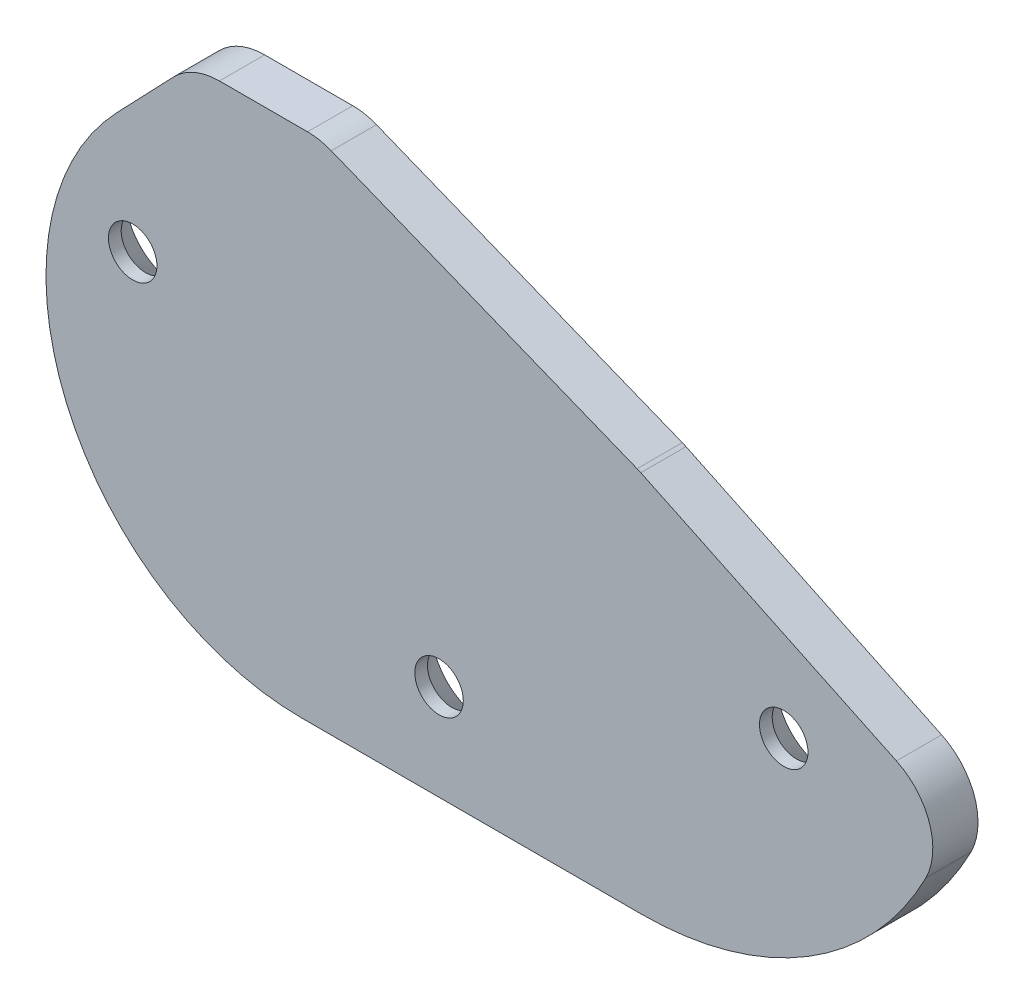
ISO-10303-21;
HEADER;
FILE_DESCRIPTION(('STEP AP214'),'2;1');
FILE_NAME('part.step','',(''),(''),'','','');
FILE_SCHEMA(('AUTOMOTIVE_DESIGN { 1 0 10303 214 1 1 1 1 }'));
ENDSEC;
DATA;
#1=APPLICATION_CONTEXT('core data for automotive mechanical design processes');
#2=APPLICATION_PROTOCOL_DEFINITION('international standard','automotive_design',2000,#1);
#3=PRODUCT_CONTEXT('',#1,'mechanical');
#4=PRODUCT('Part','Part','',(#3));
#5=PRODUCT_RELATED_PRODUCT_CATEGORY('part','',(#4));
#6=PRODUCT_DEFINITION_FORMATION('','',#4);
#7=PRODUCT_DEFINITION_CONTEXT('part definition',#1,'design');
#8=PRODUCT_DEFINITION('design','',#6,#7);
#9=PRODUCT_DEFINITION_SHAPE('','',#8);
#10=(LENGTH_UNIT() NAMED_UNIT(*) SI_UNIT(.MILLI.,.METRE.));
#11=(NAMED_UNIT(*) PLANE_ANGLE_UNIT() SI_UNIT($,.RADIAN.));
#12=(NAMED_UNIT(*) SI_UNIT($,.STERADIAN.) SOLID_ANGLE_UNIT());
#13=UNCERTAINTY_MEASURE_WITH_UNIT(LENGTH_MEASURE(1.E-05),#10,'distance_accuracy_value','');
#14=(GEOMETRIC_REPRESENTATION_CONTEXT(3) GLOBAL_UNCERTAINTY_ASSIGNED_CONTEXT((#13)) GLOBAL_UNIT_ASSIGNED_CONTEXT((#10,
#11,#12)) REPRESENTATION_CONTEXT('',''));
#15=CARTESIAN_POINT('',(0.,0.,0.));
#16=DIRECTION('',(0.,0.,1.));
#17=DIRECTION('',(1.,0.,0.));
#18=AXIS2_PLACEMENT_3D('',#15,#16,#17);
#19=CARTESIAN_POINT('',(101.6,0.,4.4958));
#20=DIRECTION('',(0.,1.,0.));
#21=DIRECTION('',(-1.,0.,0.));
#22=AXIS2_PLACEMENT_3D('',#19,#20,#21);
#23=PLANE('',#22);
#24=DIRECTION('',(0.,0.,1.));
#25=VECTOR('',#24,1.);
#26=CARTESIAN_POINT('',(70.9764049138577,0.,0.));
#27=LINE('',#26,#25);
#28=CARTESIAN_POINT('',(70.9764049138577,0.,0.));
#29=VERTEX_POINT('',#28);
#30=CARTESIAN_POINT('',(70.9764049138577,0.,4.4958));
#31=VERTEX_POINT('',#30);
#32=EDGE_CURVE('E130',#29,#31,#27,.T.);
#33=ORIENTED_EDGE('',*,*,#32,.T.);
#34=DIRECTION('',(1.,0.,0.));
#35=VECTOR('',#34,1.);
#36=CARTESIAN_POINT('',(101.6,0.,4.4958));
#37=LINE('',#36,#35);
#38=CARTESIAN_POINT('',(37.0944442407192,0.,4.4958));
#39=VERTEX_POINT('',#38);
#40=EDGE_CURVE('E162',#39,#31,#37,.T.);
#41=ORIENTED_EDGE('',*,*,#40,.F.);
#42=DIRECTION('',(0.,0.,1.));
#43=VECTOR('',#42,1.);
#44=CARTESIAN_POINT('',(37.0944442407192,0.,0.));
#45=LINE('',#44,#43);
#46=CARTESIAN_POINT('',(37.0944442407192,0.,0.));
#47=VERTEX_POINT('',#46);
#48=EDGE_CURVE('E142',#47,#39,#45,.T.);
#49=ORIENTED_EDGE('',*,*,#48,.F.);
#50=DIRECTION('',(1.,0.,0.));
#51=VECTOR('',#50,1.);
#52=CARTESIAN_POINT('',(101.6,0.,0.));
#53=LINE('',#52,#51);
#54=EDGE_CURVE('E125',#47,#29,#53,.T.);
#55=ORIENTED_EDGE('',*,*,#54,.T.);
#56=EDGE_LOOP('',(#33,#41,#49,#55));
#57=FACE_BOUND('',#56,.T.);
#58=ADVANCED_FACE('F33',(#57),#23,.F.);
#59=CARTESIAN_POINT('',(26.2420825003529,50.8,4.4958));
#60=DIRECTION('',(0.722605301638805,-0.69126086106729,0.));
#61=DIRECTION('',(0.69126086106729,0.722605301638805,0.));
#62=AXIS2_PLACEMENT_3D('',#59,#60,#61);
#63=PLANE('',#62);
#64=DIRECTION('',(-0.69126086106729,-0.722605301638805,0.));
#65=VECTOR('',#64,1.);
#66=CARTESIAN_POINT('',(26.2420825003529,50.8,4.4958));
#67=LINE('',#66,#65);
#68=CARTESIAN_POINT('',(24.366629270038,48.8395064677773,4.4958));
#69=VERTEX_POINT('',#68);
#70=CARTESIAN_POINT('',(18.7402695790936,42.9580258711092,4.4958));
#71=VERTEX_POINT('',#70);
#72=EDGE_CURVE('E153',#69,#71,#67,.T.);
#73=ORIENTED_EDGE('',*,*,#72,.F.);
#74=DIRECTION('',(0.,0.,-1.));
#75=VECTOR('',#74,1.);
#76=CARTESIAN_POINT('',(24.366629270038,48.8395064677773,4.4958));
#77=LINE('',#76,#75);
#78=CARTESIAN_POINT('',(24.366629270038,48.8395064677773,0.));
#79=VERTEX_POINT('',#78);
#80=EDGE_CURVE('E163',#69,#79,#77,.T.);
#81=ORIENTED_EDGE('',*,*,#80,.T.);
#82=DIRECTION('',(-0.69126086106729,-0.722605301638805,0.));
#83=VECTOR('',#82,1.);
#84=CARTESIAN_POINT('',(26.2420825003529,50.8,0.));
#85=LINE('',#84,#83);
#86=CARTESIAN_POINT('',(18.7402695790935,42.9580258711092,0.));
#87=VERTEX_POINT('',#86);
#88=EDGE_CURVE('E160',#79,#87,#85,.T.);
#89=ORIENTED_EDGE('',*,*,#88,.T.);
#90=DIRECTION('',(0.,0.,1.));
#91=VECTOR('',#90,1.);
#92=CARTESIAN_POINT('',(18.7402695790935,42.9580258711092,0.));
#93=LINE('',#92,#91);
#94=EDGE_CURVE('E214',#87,#71,#93,.T.);
#95=ORIENTED_EDGE('',*,*,#94,.T.);
#96=EDGE_LOOP('',(#73,#81,#89,#95));
#97=FACE_BOUND('',#96,.T.);
#98=ADVANCED_FACE('F242',(#97),#63,.F.);
#99=CARTESIAN_POINT('',(0.,0.,4.4958));
#100=DIRECTION('',(0.,0.,-1.));
#101=DIRECTION('',(-1.,0.,0.));
#102=AXIS2_PLACEMENT_3D('',#99,#100,#101);
#103=PLANE('',#102);
#104=DIRECTION('',(-1.,0.,0.));
#105=VECTOR('',#104,1.);
#106=CARTESIAN_POINT('',(26.2420825003529,50.8,4.4958));
#107=LINE('',#106,#105);
#108=CARTESIAN_POINT('',(37.7183314091178,50.8,4.4958));
#109=VERTEX_POINT('',#108);
#110=CARTESIAN_POINT('',(28.9551729354444,50.8,4.4958));
#111=VERTEX_POINT('',#110);
#112=EDGE_CURVE('E229',#109,#111,#107,.T.);
#113=ORIENTED_EDGE('',*,*,#112,.T.);
#114=CARTESIAN_POINT('',(28.9551729354445,44.45,4.4958));
#115=DIRECTION('',(0.,0.,-1.));
#116=DIRECTION('',(-1.,0.,0.));
#117=AXIS2_PLACEMENT_3D('',#114,#115,#116);
#118=CIRCLE('',#117,6.35);
#119=EDGE_CURVE('E183',#111,#69,#118,.F.);
#120=ORIENTED_EDGE('',*,*,#119,.T.);
#121=ORIENTED_EDGE('',*,*,#72,.T.);
#122=CARTESIAN_POINT('',(37.0944442407192,25.4,4.4958));
#123=DIRECTION('',(0.,0.,-1.));
#124=DIRECTION('',(1.,0.,0.));
#125=AXIS2_PLACEMENT_3D('',#122,#123,#124);
#126=CIRCLE('',#125,25.4);
#127=EDGE_CURVE('E139',#39,#71,#126,.T.);
#128=ORIENTED_EDGE('',*,*,#127,.F.);
#129=ORIENTED_EDGE('',*,*,#40,.T.);
#130=CARTESIAN_POINT('',(70.9764049138577,31.75,4.4958));
#131=DIRECTION('',(0.,0.,-1.));
#132=DIRECTION('',(-1.,0.,0.));
#133=AXIS2_PLACEMENT_3D('',#130,#131,#132);
#134=CIRCLE('',#133,31.75);
#135=CARTESIAN_POINT('',(99.2261027725313,17.2580342639913,4.4958));
#136=VERTEX_POINT('',#135);
#137=EDGE_CURVE('E131',#136,#31,#134,.T.);
#138=ORIENTED_EDGE('',*,*,#137,.F.);
#139=CARTESIAN_POINT('',(93.5761632007966,20.1564274111931,4.4958));
#140=DIRECTION('',(0.,0.,-1.));
#141=DIRECTION('',(-1.,0.,0.));
#142=AXIS2_PLACEMENT_3D('',#139,#140,#141);
#143=CIRCLE('',#142,6.35);
#144=CARTESIAN_POINT('',(96.3069073282395,25.8892745668772,4.4958));
#145=VERTEX_POINT('',#144);
#146=EDGE_CURVE('E178',#136,#145,#143,.F.);
#147=ORIENTED_EDGE('',*,*,#146,.T.);
#148=DIRECTION('',(-0.902810575698297,0.430038445266595,0.));
#149=VECTOR('',#148,1.);
#150=CARTESIAN_POINT('',(70.6920825003529,38.0904602211774,4.4958));
#151=LINE('',#150,#149);
#152=CARTESIAN_POINT('',(70.8749362686987,38.0033609421401,4.4958));
#153=VERTEX_POINT('',#152);
#154=EDGE_CURVE('E226',#145,#153,#151,.T.);
#155=ORIENTED_EDGE('',*,*,#154,.T.);
#156=CARTESIAN_POINT('',(68.1441921412558,32.2705137864559,4.4958));
#157=DIRECTION('',(0.,0.,-1.));
#158=DIRECTION('',(-1.,0.,0.));
#159=AXIS2_PLACEMENT_3D('',#156,#157,#158);
#160=CIRCLE('',#159,6.35);
#161=CARTESIAN_POINT('',(70.5040498474147,38.165729779673,4.4958));
#162=VERTEX_POINT('',#161);
#163=EDGE_CURVE('E57',#153,#162,#160,.F.);
#164=ORIENTED_EDGE('',*,*,#163,.T.);
#165=DIRECTION('',(-0.928380471372771,0.371631134828167,0.));
#166=VECTOR('',#165,1.);
#167=CARTESIAN_POINT('',(38.9420825003529,50.8,4.4958));
#168=LINE('',#167,#166);
#169=CARTESIAN_POINT('',(40.0781891152767,50.3452159932171,4.4958));
#170=VERTEX_POINT('',#169);
#171=EDGE_CURVE('E228',#162,#170,#168,.T.);
#172=ORIENTED_EDGE('',*,*,#171,.T.);
#173=CARTESIAN_POINT('',(37.7183314091178,44.45,4.4958));
#174=DIRECTION('',(0.,0.,-1.));
#175=DIRECTION('',(-1.,0.,0.));
#176=AXIS2_PLACEMENT_3D('',#173,#174,#175);
#177=CIRCLE('',#176,6.35);
#178=EDGE_CURVE('E181',#170,#109,#177,.F.);
#179=ORIENTED_EDGE('',*,*,#178,.T.);
#180=EDGE_LOOP('',(#113,#120,#121,#128,#129,#138,#147,#155,#164,#172,#179));
#181=FACE_BOUND('',#180,.T.);
#182=CARTESIAN_POINT('',(20.32,31.75,4.4958));
#183=DIRECTION('',(0.,0.,1.));
#184=DIRECTION('',(1.,0.,0.));
#185=AXIS2_PLACEMENT_3D('',#182,#183,#184);
#186=CIRCLE('',#185,2.413);
#187=CARTESIAN_POINT('',(22.733,31.75,4.4958));
#188=VERTEX_POINT('',#187);
#189=EDGE_CURVE('E144',#188,#188,#186,.T.);
#190=ORIENTED_EDGE('',*,*,#189,.F.);
#191=EDGE_LOOP('',(#190));
#192=FACE_BOUND('',#191,.T.);
#193=CARTESIAN_POINT('',(50.8,9.52499999999999,4.4958));
#194=DIRECTION('',(0.,0.,1.));
#195=DIRECTION('',(1.,0.,0.));
#196=AXIS2_PLACEMENT_3D('',#193,#194,#195);
#197=CIRCLE('',#196,2.41299999999999);
#198=CARTESIAN_POINT('',(53.213,9.52499999999999,4.4958));
#199=VERTEX_POINT('',#198);
#200=EDGE_CURVE('E150',#199,#199,#197,.T.);
#201=ORIENTED_EDGE('',*,*,#200,.F.);
#202=EDGE_LOOP('',(#201));
#203=FACE_BOUND('',#202,.T.);
#204=CARTESIAN_POINT('',(85.09,22.225,4.4958));
#205=DIRECTION('',(0.,0.,1.));
#206=DIRECTION('',(1.,0.,0.));
#207=AXIS2_PLACEMENT_3D('',#204,#205,#206);
#208=CIRCLE('',#207,2.413);
#209=CARTESIAN_POINT('',(87.503,22.225,4.4958));
#210=VERTEX_POINT('',#209);
#211=EDGE_CURVE('E218',#210,#210,#208,.T.);
#212=ORIENTED_EDGE('',*,*,#211,.F.);
#213=EDGE_LOOP('',(#212));
#214=FACE_BOUND('',#213,.T.);
#215=ADVANCED_FACE('F235',(#181,#192,#203,#214),#103,.F.);
#216=CARTESIAN_POINT('',(0.,0.,0.));
#217=DIRECTION('',(0.,0.,-1.));
#218=DIRECTION('',(-1.,0.,0.));
#219=AXIS2_PLACEMENT_3D('',#216,#217,#218);
#220=PLANE('',#219);
#221=CARTESIAN_POINT('',(85.09,22.225,0.));
#222=DIRECTION('',(0.,0.,-1.));
#223=DIRECTION('',(-1.,0.,0.));
#224=AXIS2_PLACEMENT_3D('',#221,#222,#223);
#225=CIRCLE('',#224,5.21969999999999);
#226=CARTESIAN_POINT('',(79.8703,22.225,0.));
#227=VERTEX_POINT('',#226);
#228=EDGE_CURVE('E208',#227,#227,#225,.T.);
#229=ORIENTED_EDGE('',*,*,#228,.F.);
#230=EDGE_LOOP('',(#229));
#231=FACE_BOUND('',#230,.T.);
#232=CARTESIAN_POINT('',(50.8,9.52499999999999,0.));
#233=DIRECTION('',(0.,0.,-1.));
#234=DIRECTION('',(-1.,0.,0.));
#235=AXIS2_PLACEMENT_3D('',#232,#233,#234);
#236=CIRCLE('',#235,5.2197);
#237=CARTESIAN_POINT('',(45.5803,9.52499999999999,0.));
#238=VERTEX_POINT('',#237);
#239=EDGE_CURVE('E198',#238,#238,#236,.T.);
#240=ORIENTED_EDGE('',*,*,#239,.F.);
#241=EDGE_LOOP('',(#240));
#242=FACE_BOUND('',#241,.T.);
#243=CARTESIAN_POINT('',(20.32,31.75,0.));
#244=DIRECTION('',(0.,0.,-1.));
#245=DIRECTION('',(-1.,0.,0.));
#246=AXIS2_PLACEMENT_3D('',#243,#244,#245);
#247=CIRCLE('',#246,5.2197);
#248=CARTESIAN_POINT('',(15.1003,31.75,0.));
#249=VERTEX_POINT('',#248);
#250=EDGE_CURVE('E195',#249,#249,#247,.T.);
#251=ORIENTED_EDGE('',*,*,#250,.F.);
#252=EDGE_LOOP('',(#251));
#253=FACE_BOUND('',#252,.T.);
#254=ORIENTED_EDGE('',*,*,#88,.F.);
#255=CARTESIAN_POINT('',(28.9551729354445,44.45,0.));
#256=DIRECTION('',(0.,0.,-1.));
#257=DIRECTION('',(-1.,0.,0.));
#258=AXIS2_PLACEMENT_3D('',#255,#256,#257);
#259=CIRCLE('',#258,6.35);
#260=CARTESIAN_POINT('',(28.9551729354444,50.8,0.));
#261=VERTEX_POINT('',#260);
#262=EDGE_CURVE('E171',#79,#261,#259,.T.);
#263=ORIENTED_EDGE('',*,*,#262,.T.);
#264=DIRECTION('',(-1.,0.,0.));
#265=VECTOR('',#264,1.);
#266=CARTESIAN_POINT('',(26.2420825003529,50.8,0.));
#267=LINE('',#266,#265);
#268=CARTESIAN_POINT('',(37.7183314091178,50.8,0.));
#269=VERTEX_POINT('',#268);
#270=EDGE_CURVE('E157',#269,#261,#267,.T.);
#271=ORIENTED_EDGE('',*,*,#270,.F.);
#272=CARTESIAN_POINT('',(37.7183314091178,44.45,0.));
#273=DIRECTION('',(0.,0.,-1.));
#274=DIRECTION('',(-1.,0.,0.));
#275=AXIS2_PLACEMENT_3D('',#272,#273,#274);
#276=CIRCLE('',#275,6.35);
#277=CARTESIAN_POINT('',(40.0781891152767,50.3452159932171,0.));
#278=VERTEX_POINT('',#277);
#279=EDGE_CURVE('E169',#269,#278,#276,.T.);
#280=ORIENTED_EDGE('',*,*,#279,.T.);
#281=DIRECTION('',(-0.928380471372771,0.371631134828167,0.));
#282=VECTOR('',#281,1.);
#283=CARTESIAN_POINT('',(38.9420825003529,50.8,0.));
#284=LINE('',#283,#282);
#285=CARTESIAN_POINT('',(70.5040498474147,38.165729779673,0.));
#286=VERTEX_POINT('',#285);
#287=EDGE_CURVE('E147',#286,#278,#284,.T.);
#288=ORIENTED_EDGE('',*,*,#287,.F.);
#289=CARTESIAN_POINT('',(68.1441921412558,32.2705137864559,0.));
#290=DIRECTION('',(0.,0.,-1.));
#291=DIRECTION('',(-1.,0.,0.));
#292=AXIS2_PLACEMENT_3D('',#289,#290,#291);
#293=CIRCLE('',#292,6.35);
#294=CARTESIAN_POINT('',(70.8749362686987,38.0033609421401,0.));
#295=VERTEX_POINT('',#294);
#296=EDGE_CURVE('E167',#286,#295,#293,.T.);
#297=ORIENTED_EDGE('',*,*,#296,.T.);
#298=DIRECTION('',(-0.902810575698297,0.430038445266595,0.));
#299=VECTOR('',#298,1.);
#300=CARTESIAN_POINT('',(70.6920825003529,38.0904602211774,0.));
#301=LINE('',#300,#299);
#302=CARTESIAN_POINT('',(96.3069073282395,25.8892745668772,0.));
#303=VERTEX_POINT('',#302);
#304=EDGE_CURVE('E143',#303,#295,#301,.T.);
#305=ORIENTED_EDGE('',*,*,#304,.F.);
#306=CARTESIAN_POINT('',(93.5761632007966,20.1564274111931,0.));
#307=DIRECTION('',(0.,0.,-1.));
#308=DIRECTION('',(-1.,0.,0.));
#309=AXIS2_PLACEMENT_3D('',#306,#307,#308);
#310=CIRCLE('',#309,6.35);
#311=CARTESIAN_POINT('',(99.2261027725313,17.2580342639913,0.));
#312=VERTEX_POINT('',#311);
#313=EDGE_CURVE('E127',#303,#312,#310,.T.);
#314=ORIENTED_EDGE('',*,*,#313,.T.);
#315=CARTESIAN_POINT('',(70.9764049138577,31.75,0.));
#316=DIRECTION('',(0.,0.,-1.));
#317=DIRECTION('',(-1.,0.,0.));
#318=AXIS2_PLACEMENT_3D('',#315,#316,#317);
#319=CIRCLE('',#318,31.75);
#320=EDGE_CURVE('E119',#312,#29,#319,.T.);
#321=ORIENTED_EDGE('',*,*,#320,.T.);
#322=ORIENTED_EDGE('',*,*,#54,.F.);
#323=CARTESIAN_POINT('',(37.0944442407192,25.4,0.));
#324=DIRECTION('',(0.,0.,-1.));
#325=DIRECTION('',(1.,0.,0.));
#326=AXIS2_PLACEMENT_3D('',#323,#324,#325);
#327=CIRCLE('',#326,25.4);
#328=EDGE_CURVE('E212',#47,#87,#327,.T.);
#329=ORIENTED_EDGE('',*,*,#328,.T.);
#330=EDGE_LOOP('',(#254,#263,#271,#280,#288,#297,#305,#314,#321,#322,#329));
#331=FACE_BOUND('',#330,.T.);
#332=ADVANCED_FACE('F122',(#231,#242,#253,#331),#220,.T.);
#333=CARTESIAN_POINT('',(70.6920825003529,38.0904602211774,4.4958));
#334=DIRECTION('',(-0.430038445266595,-0.902810575698296,0.));
#335=DIRECTION('',(0.902810575698297,-0.430038445266595,0.));
#336=AXIS2_PLACEMENT_3D('',#333,#334,#335);
#337=PLANE('',#336);
#338=ORIENTED_EDGE('',*,*,#304,.T.);
#339=DIRECTION('',(0.,0.,-1.));
#340=VECTOR('',#339,1.);
#341=CARTESIAN_POINT('',(70.8749362686987,38.0033609421401,4.4958));
#342=LINE('',#341,#340);
#343=EDGE_CURVE('E42',#295,#153,#342,.F.);
#344=ORIENTED_EDGE('',*,*,#343,.T.);
#345=ORIENTED_EDGE('',*,*,#154,.F.);
#346=DIRECTION('',(0.,0.,1.));
#347=VECTOR('',#346,1.);
#348=CARTESIAN_POINT('',(96.3069073282395,25.8892745668772,4.4958));
#349=LINE('',#348,#347);
#350=EDGE_CURVE('E189',#145,#303,#349,.F.);
#351=ORIENTED_EDGE('',*,*,#350,.T.);
#352=EDGE_LOOP('',(#338,#344,#345,#351));
#353=FACE_BOUND('',#352,.T.);
#354=ADVANCED_FACE('F268',(#353),#337,.F.);
#355=CARTESIAN_POINT('',(38.9420825003529,50.8,4.4958));
#356=DIRECTION('',(-0.371631134828167,-0.928380471372771,0.));
#357=DIRECTION('',(0.928380471372771,-0.371631134828167,0.));
#358=AXIS2_PLACEMENT_3D('',#355,#356,#357);
#359=PLANE('',#358);
#360=ORIENTED_EDGE('',*,*,#287,.T.);
#361=DIRECTION('',(0.,0.,-1.));
#362=VECTOR('',#361,1.);
#363=CARTESIAN_POINT('',(40.0781891152767,50.3452159932171,4.4958));
#364=LINE('',#363,#362);
#365=EDGE_CURVE('E50',#278,#170,#364,.F.);
#366=ORIENTED_EDGE('',*,*,#365,.T.);
#367=ORIENTED_EDGE('',*,*,#171,.F.);
#368=DIRECTION('',(0.,0.,-1.));
#369=VECTOR('',#368,1.);
#370=CARTESIAN_POINT('',(70.5040498474147,38.165729779673,4.4958));
#371=LINE('',#370,#369);
#372=EDGE_CURVE('E185',#162,#286,#371,.T.);
#373=ORIENTED_EDGE('',*,*,#372,.T.);
#374=EDGE_LOOP('',(#360,#366,#367,#373));
#375=FACE_BOUND('',#374,.T.);
#376=ADVANCED_FACE('F271',(#375),#359,.F.);
#377=CARTESIAN_POINT('',(26.2420825003529,50.8,4.4958));
#378=DIRECTION('',(0.,-1.,0.));
#379=DIRECTION('',(1.,0.,0.));
#380=AXIS2_PLACEMENT_3D('',#377,#378,#379);
#381=PLANE('',#380);
#382=ORIENTED_EDGE('',*,*,#270,.T.);
#383=DIRECTION('',(0.,0.,-1.));
#384=VECTOR('',#383,1.);
#385=CARTESIAN_POINT('',(28.9551729354444,50.8,4.4958));
#386=LINE('',#385,#384);
#387=EDGE_CURVE('E176',#261,#111,#386,.F.);
#388=ORIENTED_EDGE('',*,*,#387,.T.);
#389=ORIENTED_EDGE('',*,*,#112,.F.);
#390=DIRECTION('',(0.,0.,-1.));
#391=VECTOR('',#390,1.);
#392=CARTESIAN_POINT('',(37.7183314091178,50.8,4.4958));
#393=LINE('',#392,#391);
#394=EDGE_CURVE('E173',#109,#269,#393,.T.);
#395=ORIENTED_EDGE('',*,*,#394,.T.);
#396=EDGE_LOOP('',(#382,#388,#389,#395));
#397=FACE_BOUND('',#396,.T.);
#398=ADVANCED_FACE('F247',(#397),#381,.F.);
#399=CARTESIAN_POINT('',(20.32,31.75,4.4958));
#400=DIRECTION('',(0.,0.,-1.));
#401=DIRECTION('',(-1.,0.,0.));
#402=AXIS2_PLACEMENT_3D('',#399,#400,#401);
#403=CYLINDRICAL_SURFACE('',#402,2.413);
#404=CARTESIAN_POINT('',(20.32,31.75,3.2287390085472));
#405=DIRECTION('',(0.,0.,-1.));
#406=DIRECTION('',(-1.,0.,0.));
#407=AXIS2_PLACEMENT_3D('',#404,#405,#406);
#408=CIRCLE('',#407,2.413);
#409=CARTESIAN_POINT('',(17.907,31.75,3.2287390085472));
#410=VERTEX_POINT('',#409);
#411=EDGE_CURVE('E193',#410,#410,#408,.F.);
#412=ORIENTED_EDGE('',*,*,#411,.F.);
#413=EDGE_LOOP('',(#412));
#414=FACE_BOUND('',#413,.T.);
#415=ORIENTED_EDGE('',*,*,#189,.T.);
#416=EDGE_LOOP('',(#415));
#417=FACE_BOUND('',#416,.T.);
#418=ADVANCED_FACE('F276',(#414,#417),#403,.F.);
#419=CARTESIAN_POINT('',(50.8,9.52499999999999,4.4958));
#420=DIRECTION('',(0.,0.,-1.));
#421=DIRECTION('',(-1.,0.,0.));
#422=AXIS2_PLACEMENT_3D('',#419,#420,#421);
#423=CYLINDRICAL_SURFACE('',#422,2.41299999999999);
#424=CARTESIAN_POINT('',(50.8,9.52499999999999,3.2287390085472));
#425=DIRECTION('',(0.,0.,-1.));
#426=DIRECTION('',(-1.,0.,0.));
#427=AXIS2_PLACEMENT_3D('',#424,#425,#426);
#428=CIRCLE('',#427,2.41299999999999);
#429=CARTESIAN_POINT('',(48.387,9.52499999999999,3.2287390085472));
#430=VERTEX_POINT('',#429);
#431=EDGE_CURVE('E196',#430,#430,#428,.F.);
#432=ORIENTED_EDGE('',*,*,#431,.F.);
#433=EDGE_LOOP('',(#432));
#434=FACE_BOUND('',#433,.T.);
#435=ORIENTED_EDGE('',*,*,#200,.T.);
#436=EDGE_LOOP('',(#435));
#437=FACE_BOUND('',#436,.T.);
#438=ADVANCED_FACE('F285',(#434,#437),#423,.F.);
#439=CARTESIAN_POINT('',(85.09,22.225,4.4958));
#440=DIRECTION('',(0.,0.,-1.));
#441=DIRECTION('',(-1.,0.,0.));
#442=AXIS2_PLACEMENT_3D('',#439,#440,#441);
#443=CYLINDRICAL_SURFACE('',#442,2.413);
#444=CARTESIAN_POINT('',(85.09,22.225,3.22873900854719));
#445=DIRECTION('',(0.,0.,-1.));
#446=DIRECTION('',(-1.,0.,0.));
#447=AXIS2_PLACEMENT_3D('',#444,#445,#446);
#448=CIRCLE('',#447,2.413);
#449=CARTESIAN_POINT('',(82.677,22.225,3.22873900854719));
#450=VERTEX_POINT('',#449);
#451=EDGE_CURVE('E37',#450,#450,#448,.F.);
#452=ORIENTED_EDGE('',*,*,#451,.F.);
#453=EDGE_LOOP('',(#452));
#454=FACE_BOUND('',#453,.T.);
#455=ORIENTED_EDGE('',*,*,#211,.T.);
#456=EDGE_LOOP('',(#455));
#457=FACE_BOUND('',#456,.T.);
#458=ADVANCED_FACE('F289',(#454,#457),#443,.F.);
#459=CARTESIAN_POINT('',(37.0944442407192,25.4,0.));
#460=DIRECTION('',(0.,0.,1.));
#461=DIRECTION('',(1.,0.,0.));
#462=AXIS2_PLACEMENT_3D('',#459,#460,#461);
#463=CYLINDRICAL_SURFACE('',#462,25.4);
#464=ORIENTED_EDGE('',*,*,#127,.T.);
#465=ORIENTED_EDGE('',*,*,#94,.F.);
#466=ORIENTED_EDGE('',*,*,#328,.F.);
#467=ORIENTED_EDGE('',*,*,#48,.T.);
#468=EDGE_LOOP('',(#464,#465,#466,#467));
#469=FACE_BOUND('',#468,.T.);
#470=ADVANCED_FACE('F241',(#469),#463,.T.);
#471=CARTESIAN_POINT('',(70.9764049138577,31.75,0.));
#472=DIRECTION('',(0.,0.,1.));
#473=DIRECTION('',(1.,0.,0.));
#474=AXIS2_PLACEMENT_3D('',#471,#472,#473);
#475=CYLINDRICAL_SURFACE('',#474,31.75);
#476=ORIENTED_EDGE('',*,*,#320,.F.);
#477=DIRECTION('',(0.,0.,1.));
#478=VECTOR('',#477,1.);
#479=CARTESIAN_POINT('',(99.2261027725313,17.2580342639913,0.));
#480=LINE('',#479,#478);
#481=EDGE_CURVE('E11',#312,#136,#480,.T.);
#482=ORIENTED_EDGE('',*,*,#481,.T.);
#483=ORIENTED_EDGE('',*,*,#137,.T.);
#484=ORIENTED_EDGE('',*,*,#32,.F.);
#485=EDGE_LOOP('',(#476,#482,#483,#484));
#486=FACE_BOUND('',#485,.T.);
#487=ADVANCED_FACE('F134',(#486),#475,.T.);
#488=CARTESIAN_POINT('',(28.9551729354445,44.45,4.4958));
#489=DIRECTION('',(0.,0.,-1.));
#490=DIRECTION('',(-1.,0.,0.));
#491=AXIS2_PLACEMENT_3D('',#488,#489,#490);
#492=CYLINDRICAL_SURFACE('',#491,6.35);
#493=ORIENTED_EDGE('',*,*,#119,.F.);
#494=ORIENTED_EDGE('',*,*,#387,.F.);
#495=ORIENTED_EDGE('',*,*,#262,.F.);
#496=ORIENTED_EDGE('',*,*,#80,.F.);
#497=EDGE_LOOP('',(#493,#494,#495,#496));
#498=FACE_BOUND('',#497,.T.);
#499=ADVANCED_FACE('F249',(#498),#492,.T.);
#500=CARTESIAN_POINT('',(37.7183314091178,44.45,4.4958));
#501=DIRECTION('',(0.,0.,-1.));
#502=DIRECTION('',(-1.,0.,0.));
#503=AXIS2_PLACEMENT_3D('',#500,#501,#502);
#504=CYLINDRICAL_SURFACE('',#503,6.35);
#505=ORIENTED_EDGE('',*,*,#178,.F.);
#506=ORIENTED_EDGE('',*,*,#365,.F.);
#507=ORIENTED_EDGE('',*,*,#279,.F.);
#508=ORIENTED_EDGE('',*,*,#394,.F.);
#509=EDGE_LOOP('',(#505,#506,#507,#508));
#510=FACE_BOUND('',#509,.T.);
#511=ADVANCED_FACE('F251',(#510),#504,.T.);
#512=CARTESIAN_POINT('',(68.1441921412558,32.2705137864559,4.4958));
#513=DIRECTION('',(0.,0.,-1.));
#514=DIRECTION('',(-1.,0.,0.));
#515=AXIS2_PLACEMENT_3D('',#512,#513,#514);
#516=CYLINDRICAL_SURFACE('',#515,6.35);
#517=ORIENTED_EDGE('',*,*,#163,.F.);
#518=ORIENTED_EDGE('',*,*,#343,.F.);
#519=ORIENTED_EDGE('',*,*,#296,.F.);
#520=ORIENTED_EDGE('',*,*,#372,.F.);
#521=EDGE_LOOP('',(#517,#518,#519,#520));
#522=FACE_BOUND('',#521,.T.);
#523=ADVANCED_FACE('F257',(#522),#516,.T.);
#524=CARTESIAN_POINT('',(93.5761632007966,20.1564274111931,0.));
#525=DIRECTION('',(0.,0.,1.));
#526=DIRECTION('',(1.,0.,0.));
#527=AXIS2_PLACEMENT_3D('',#524,#525,#526);
#528=CYLINDRICAL_SURFACE('',#527,6.35);
#529=ORIENTED_EDGE('',*,*,#146,.F.);
#530=ORIENTED_EDGE('',*,*,#481,.F.);
#531=ORIENTED_EDGE('',*,*,#313,.F.);
#532=ORIENTED_EDGE('',*,*,#350,.F.);
#533=EDGE_LOOP('',(#529,#530,#531,#532));
#534=FACE_BOUND('',#533,.T.);
#535=ADVANCED_FACE('F35',(#534),#528,.T.);
#536=CARTESIAN_POINT('',(20.32,31.75,0.));
#537=DIRECTION('',(0.,0.,-1.));
#538=DIRECTION('',(-1.,0.,0.));
#539=AXIS2_PLACEMENT_3D('',#536,#537,#538);
#540=CONICAL_SURFACE('',#539,5.2197,0.715584993317677);
#541=ORIENTED_EDGE('',*,*,#411,.T.);
#542=EDGE_LOOP('',(#541));
#543=FACE_BOUND('',#542,.T.);
#544=ORIENTED_EDGE('',*,*,#250,.T.);
#545=EDGE_LOOP('',(#544));
#546=FACE_BOUND('',#545,.T.);
#547=ADVANCED_FACE('F296',(#543,#546),#540,.F.);
#548=CARTESIAN_POINT('',(50.8,9.52499999999999,0.));
#549=DIRECTION('',(0.,0.,-1.));
#550=DIRECTION('',(-1.,0.,0.));
#551=AXIS2_PLACEMENT_3D('',#548,#549,#550);
#552=CONICAL_SURFACE('',#551,5.2197,0.715584993317677);
#553=ORIENTED_EDGE('',*,*,#431,.T.);
#554=EDGE_LOOP('',(#553));
#555=FACE_BOUND('',#554,.T.);
#556=ORIENTED_EDGE('',*,*,#239,.T.);
#557=EDGE_LOOP('',(#556));
#558=FACE_BOUND('',#557,.T.);
#559=ADVANCED_FACE('F299',(#555,#558),#552,.F.);
#560=CARTESIAN_POINT('',(85.09,22.225,0.));
#561=DIRECTION('',(0.,0.,-1.));
#562=DIRECTION('',(-1.,0.,0.));
#563=AXIS2_PLACEMENT_3D('',#560,#561,#562);
#564=CONICAL_SURFACE('',#563,5.21969999999999,0.715584993317677);
#565=ORIENTED_EDGE('',*,*,#451,.T.);
#566=EDGE_LOOP('',(#565));
#567=FACE_BOUND('',#566,.T.);
#568=ORIENTED_EDGE('',*,*,#228,.T.);
#569=EDGE_LOOP('',(#568));
#570=FACE_BOUND('',#569,.T.);
#571=ADVANCED_FACE('F303',(#567,#570),#564,.F.);
#572=CLOSED_SHELL('',(#58,#98,#215,#332,#354,#376,#398,#418,#438,#458,#470,#487,#499,#511,#523,
#535,#547,#559,#571));
#573=MANIFOLD_SOLID_BREP('B2',#572);
#574=ADVANCED_BREP_SHAPE_REPRESENTATION('',(#18,#573),#14);
#575=SHAPE_DEFINITION_REPRESENTATION(#9,#574);
ENDSEC;
END-ISO-10303-21;
